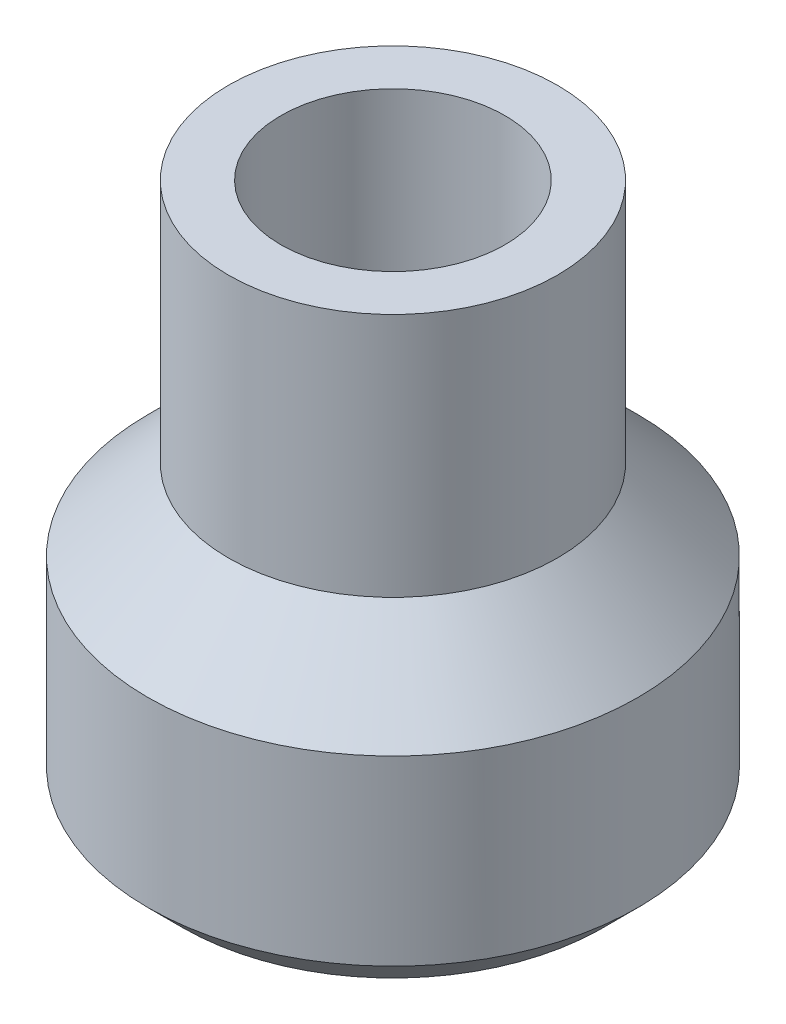
ISO-10303-21;
HEADER;
FILE_DESCRIPTION(('STEP AP214'),'2;1');
FILE_NAME('part.step','',(''),(''),'','','');
FILE_SCHEMA(('AUTOMOTIVE_DESIGN { 1 0 10303 214 1 1 1 1 }'));
ENDSEC;
DATA;
#1=APPLICATION_CONTEXT('core data for automotive mechanical design processes');
#2=APPLICATION_PROTOCOL_DEFINITION('international standard','automotive_design',2000,#1);
#3=PRODUCT_CONTEXT('',#1,'mechanical');
#4=PRODUCT('Part','Part','',(#3));
#5=PRODUCT_RELATED_PRODUCT_CATEGORY('part','',(#4));
#6=PRODUCT_DEFINITION_FORMATION('','',#4);
#7=PRODUCT_DEFINITION_CONTEXT('part definition',#1,'design');
#8=PRODUCT_DEFINITION('design','',#6,#7);
#9=PRODUCT_DEFINITION_SHAPE('','',#8);
#10=(LENGTH_UNIT() NAMED_UNIT(*) SI_UNIT(.MILLI.,.METRE.));
#11=(NAMED_UNIT(*) PLANE_ANGLE_UNIT() SI_UNIT($,.RADIAN.));
#12=(NAMED_UNIT(*) SI_UNIT($,.STERADIAN.) SOLID_ANGLE_UNIT());
#13=UNCERTAINTY_MEASURE_WITH_UNIT(LENGTH_MEASURE(1.E-05),#10,'distance_accuracy_value','');
#14=(GEOMETRIC_REPRESENTATION_CONTEXT(3) GLOBAL_UNCERTAINTY_ASSIGNED_CONTEXT((#13)) GLOBAL_UNIT_ASSIGNED_CONTEXT((#10,
#11,#12)) REPRESENTATION_CONTEXT('',''));
#15=CARTESIAN_POINT('',(0.,0.,0.));
#16=DIRECTION('',(0.,0.,1.));
#17=DIRECTION('',(1.,0.,0.));
#18=AXIS2_PLACEMENT_3D('',#15,#16,#17);
#19=CARTESIAN_POINT('',(0.,10.,0.));
#20=DIRECTION('',(0.,1.,0.));
#21=DIRECTION('',(0.,0.,1.));
#22=AXIS2_PLACEMENT_3D('',#19,#20,#21);
#23=PLANE('',#22);
#24=CARTESIAN_POINT('',(0.,10.,0.));
#25=DIRECTION('',(0.,1.,0.));
#26=DIRECTION('',(0.,0.,1.));
#27=AXIS2_PLACEMENT_3D('',#24,#25,#26);
#28=CIRCLE('',#27,4.7);
#29=CARTESIAN_POINT('',(0.,10.,4.7));
#30=VERTEX_POINT('',#29);
#31=EDGE_CURVE('E62',#30,#30,#28,.T.);
#32=ORIENTED_EDGE('',*,*,#31,.T.);
#33=EDGE_LOOP('',(#32));
#34=FACE_BOUND('',#33,.T.);
#35=CARTESIAN_POINT('',(0.,10.,0.));
#36=DIRECTION('',(0.,1.,0.));
#37=DIRECTION('',(0.,0.,1.));
#38=AXIS2_PLACEMENT_3D('',#35,#36,#37);
#39=CIRCLE('',#38,3.2);
#40=CARTESIAN_POINT('',(0.,10.,3.2));
#41=VERTEX_POINT('',#40);
#42=EDGE_CURVE('E65',#41,#41,#39,.T.);
#43=ORIENTED_EDGE('',*,*,#42,.F.);
#44=EDGE_LOOP('',(#43));
#45=FACE_BOUND('',#44,.T.);
#46=ADVANCED_FACE('F35',(#34,#45),#23,.T.);
#47=CARTESIAN_POINT('',(0.,10.,0.));
#48=DIRECTION('',(0.,-1.,0.));
#49=DIRECTION('',(0.,0.,-1.));
#50=AXIS2_PLACEMENT_3D('',#47,#48,#49);
#51=CYLINDRICAL_SURFACE('',#50,4.7);
#52=CARTESIAN_POINT('',(0.,3.00000000000005,0.));
#53=DIRECTION('',(0.,1.,0.));
#54=DIRECTION('',(0.,0.,1.));
#55=AXIS2_PLACEMENT_3D('',#52,#53,#54);
#56=CIRCLE('',#55,4.7);
#57=CARTESIAN_POINT('',(0.,3.00000000000005,4.7));
#58=VERTEX_POINT('',#57);
#59=EDGE_CURVE('E51',#58,#58,#56,.T.);
#60=ORIENTED_EDGE('',*,*,#59,.T.);
#61=EDGE_LOOP('',(#60));
#62=FACE_BOUND('',#61,.T.);
#63=ORIENTED_EDGE('',*,*,#31,.F.);
#64=EDGE_LOOP('',(#63));
#65=FACE_BOUND('',#64,.T.);
#66=ADVANCED_FACE('F89',(#62,#65),#51,.T.);
#67=CARTESIAN_POINT('',(0.,10.,0.));
#68=DIRECTION('',(0.,-1.,0.));
#69=DIRECTION('',(0.,0.,-1.));
#70=AXIS2_PLACEMENT_3D('',#67,#68,#69);
#71=CYLINDRICAL_SURFACE('',#70,3.2);
#72=CARTESIAN_POINT('',(0.,-0.999999999999996,0.));
#73=DIRECTION('',(0.,1.,0.));
#74=DIRECTION('',(0.,0.,1.));
#75=AXIS2_PLACEMENT_3D('',#72,#73,#74);
#76=CIRCLE('',#75,3.2);
#77=CARTESIAN_POINT('',(0.,-0.999999999999996,3.2));
#78=VERTEX_POINT('',#77);
#79=EDGE_CURVE('E11',#78,#78,#76,.F.);
#80=ORIENTED_EDGE('',*,*,#79,.T.);
#81=EDGE_LOOP('',(#80));
#82=FACE_BOUND('',#81,.T.);
#83=ORIENTED_EDGE('',*,*,#42,.T.);
#84=EDGE_LOOP('',(#83));
#85=FACE_BOUND('',#84,.T.);
#86=ADVANCED_FACE('F95',(#82,#85),#71,.F.);
#87=CARTESIAN_POINT('',(0.,-6.,0.));
#88=DIRECTION('',(0.,1.,0.));
#89=DIRECTION('',(0.,0.,1.));
#90=AXIS2_PLACEMENT_3D('',#87,#88,#89);
#91=CYLINDRICAL_SURFACE('',#90,7.);
#92=CARTESIAN_POINT('',(0.,0.700000000000028,0.));
#93=DIRECTION('',(0.,-1.,0.));
#94=DIRECTION('',(0.,0.,-1.));
#95=AXIS2_PLACEMENT_3D('',#92,#93,#94);
#96=CIRCLE('',#95,7.);
#97=CARTESIAN_POINT('',(0.,0.700000000000028,-7.));
#98=VERTEX_POINT('',#97);
#99=EDGE_CURVE('E47',#98,#98,#96,.T.);
#100=ORIENTED_EDGE('',*,*,#99,.T.);
#101=EDGE_LOOP('',(#100));
#102=FACE_BOUND('',#101,.T.);
#103=CARTESIAN_POINT('',(0.,-4.49999999999997,0.));
#104=DIRECTION('',(0.,1.,0.));
#105=DIRECTION('',(0.,0.,1.));
#106=AXIS2_PLACEMENT_3D('',#103,#104,#105);
#107=CIRCLE('',#106,7.);
#108=CARTESIAN_POINT('',(0.,-4.49999999999997,7.));
#109=VERTEX_POINT('',#108);
#110=EDGE_CURVE('E59',#109,#109,#107,.T.);
#111=ORIENTED_EDGE('',*,*,#110,.T.);
#112=EDGE_LOOP('',(#111));
#113=FACE_BOUND('',#112,.T.);
#114=ADVANCED_FACE('F86',(#102,#113),#91,.T.);
#115=CARTESIAN_POINT('',(0.,-2.,0.));
#116=DIRECTION('',(0.,1.,0.));
#117=DIRECTION('',(0.,0.,1.));
#118=AXIS2_PLACEMENT_3D('',#115,#116,#117);
#119=PLANE('',#118);
#120=CARTESIAN_POINT('',(0.,-2.,0.));
#121=DIRECTION('',(0.,1.,0.));
#122=DIRECTION('',(0.,0.,1.));
#123=AXIS2_PLACEMENT_3D('',#120,#121,#122);
#124=CIRCLE('',#123,4.2);
#125=CARTESIAN_POINT('',(0.,-2.,4.2));
#126=VERTEX_POINT('',#125);
#127=EDGE_CURVE('E43',#126,#126,#124,.T.);
#128=ORIENTED_EDGE('',*,*,#127,.T.);
#129=EDGE_LOOP('',(#128));
#130=FACE_BOUND('',#129,.T.);
#131=CARTESIAN_POINT('',(0.,-2.,0.));
#132=DIRECTION('',(0.,1.,0.));
#133=DIRECTION('',(0.,0.,1.));
#134=AXIS2_PLACEMENT_3D('',#131,#132,#133);
#135=CIRCLE('',#134,6.);
#136=CARTESIAN_POINT('',(0.,-2.,6.));
#137=VERTEX_POINT('',#136);
#138=EDGE_CURVE('E68',#137,#137,#135,.F.);
#139=ORIENTED_EDGE('',*,*,#138,.T.);
#140=EDGE_LOOP('',(#139));
#141=FACE_BOUND('',#140,.T.);
#142=ADVANCED_FACE('F72',(#130,#141),#119,.F.);
#143=CARTESIAN_POINT('',(0.,16.9705627484771,0.));
#144=DIRECTION('',(0.,-1.,0.));
#145=DIRECTION('',(0.,0.,-1.));
#146=AXIS2_PLACEMENT_3D('',#143,#144,#145);
#147=CYLINDRICAL_SURFACE('',#146,6.);
#148=CARTESIAN_POINT('',(0.,-5.49999999999998,0.));
#149=DIRECTION('',(0.,1.,0.));
#150=DIRECTION('',(0.,0.,1.));
#151=AXIS2_PLACEMENT_3D('',#148,#149,#150);
#152=CIRCLE('',#151,6.);
#153=CARTESIAN_POINT('',(0.,-5.49999999999998,6.));
#154=VERTEX_POINT('',#153);
#155=EDGE_CURVE('E56',#154,#154,#152,.F.);
#156=ORIENTED_EDGE('',*,*,#155,.T.);
#157=EDGE_LOOP('',(#156));
#158=FACE_BOUND('',#157,.T.);
#159=ORIENTED_EDGE('',*,*,#138,.F.);
#160=EDGE_LOOP('',(#159));
#161=FACE_BOUND('',#160,.T.);
#162=ADVANCED_FACE('F74',(#158,#161),#147,.F.);
#163=CARTESIAN_POINT('',(0.,-4.49999999999997,0.));
#164=DIRECTION('',(0.,1.,0.));
#165=DIRECTION('',(0.,0.,1.));
#166=AXIS2_PLACEMENT_3D('',#163,#164,#165);
#167=CONICAL_SURFACE('',#166,7.,0.785398163397443);
#168=ORIENTED_EDGE('',*,*,#155,.F.);
#169=EDGE_LOOP('',(#168));
#170=FACE_BOUND('',#169,.T.);
#171=ORIENTED_EDGE('',*,*,#110,.F.);
#172=EDGE_LOOP('',(#171));
#173=FACE_BOUND('',#172,.T.);
#174=ADVANCED_FACE('F76',(#170,#173),#167,.T.);
#175=CARTESIAN_POINT('',(0.,3.00000000000005,0.));
#176=DIRECTION('',(0.,-1.,0.));
#177=DIRECTION('',(0.,0.,-1.));
#178=AXIS2_PLACEMENT_3D('',#175,#176,#177);
#179=CONICAL_SURFACE('',#178,4.7,0.785398163397443);
#180=ORIENTED_EDGE('',*,*,#99,.F.);
#181=EDGE_LOOP('',(#180));
#182=FACE_BOUND('',#181,.T.);
#183=ORIENTED_EDGE('',*,*,#59,.F.);
#184=EDGE_LOOP('',(#183));
#185=FACE_BOUND('',#184,.T.);
#186=ADVANCED_FACE('F83',(#182,#185),#179,.T.);
#187=CARTESIAN_POINT('',(0.,-2.,0.));
#188=DIRECTION('',(0.,-1.,0.));
#189=DIRECTION('',(0.,0.,-1.));
#190=AXIS2_PLACEMENT_3D('',#187,#188,#189);
#191=CONICAL_SURFACE('',#190,4.2,0.785398163397446);
#192=ORIENTED_EDGE('',*,*,#79,.F.);
#193=EDGE_LOOP('',(#192));
#194=FACE_BOUND('',#193,.T.);
#195=ORIENTED_EDGE('',*,*,#127,.F.);
#196=EDGE_LOOP('',(#195));
#197=FACE_BOUND('',#196,.T.);
#198=ADVANCED_FACE('F38',(#194,#197),#191,.F.);
#199=CLOSED_SHELL('',(#46,#66,#86,#114,#142,#162,#174,#186,#198));
#200=MANIFOLD_SOLID_BREP('B2',#199);
#201=ADVANCED_BREP_SHAPE_REPRESENTATION('',(#18,#200),#14);
#202=SHAPE_DEFINITION_REPRESENTATION(#9,#201);
ENDSEC;
END-ISO-10303-21;
